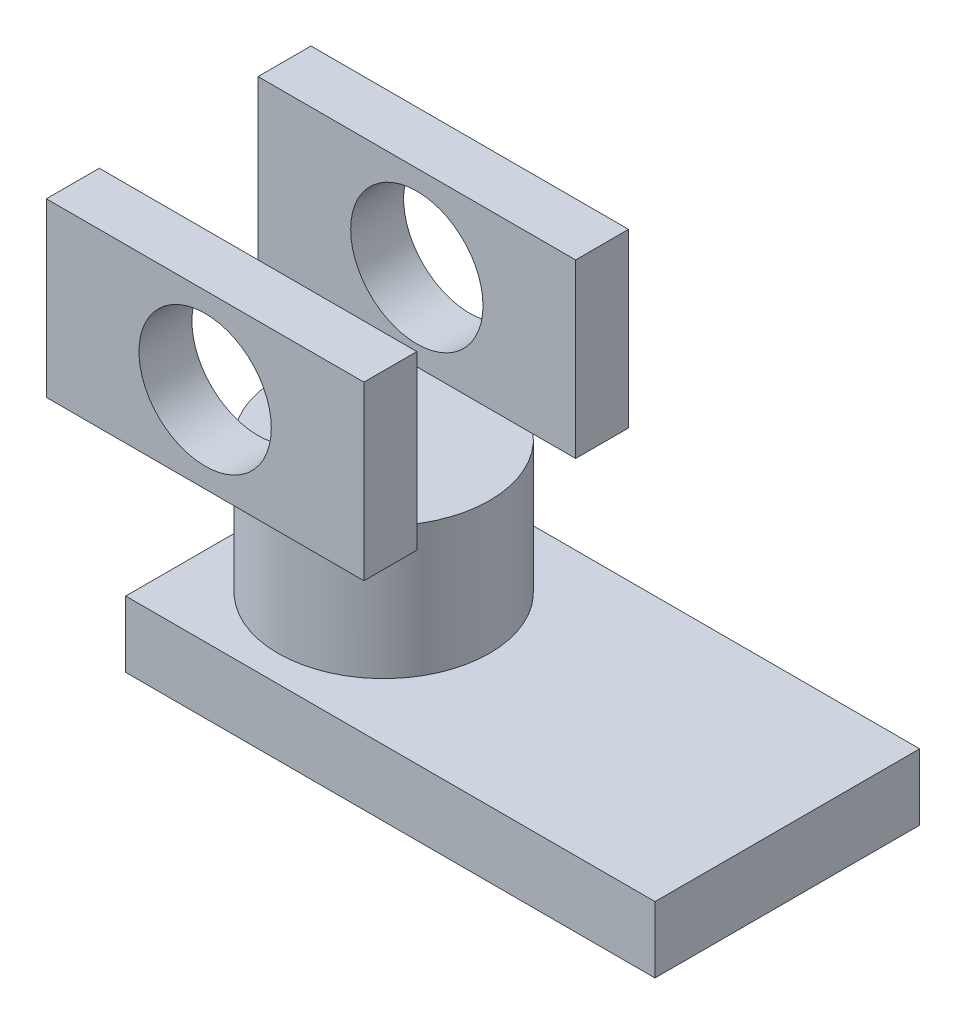
ISO-10303-21;
HEADER;
FILE_DESCRIPTION(('STEP AP214'),'2;1');
FILE_NAME('part.step','',(''),(''),'','','');
FILE_SCHEMA(('AUTOMOTIVE_DESIGN { 1 0 10303 214 1 1 1 1 }'));
ENDSEC;
DATA;
#1=APPLICATION_CONTEXT('core data for automotive mechanical design processes');
#2=APPLICATION_PROTOCOL_DEFINITION('international standard','automotive_design',2000,#1);
#3=PRODUCT_CONTEXT('',#1,'mechanical');
#4=PRODUCT('Part','Part','',(#3));
#5=PRODUCT_RELATED_PRODUCT_CATEGORY('part','',(#4));
#6=PRODUCT_DEFINITION_FORMATION('','',#4);
#7=PRODUCT_DEFINITION_CONTEXT('part definition',#1,'design');
#8=PRODUCT_DEFINITION('design','',#6,#7);
#9=PRODUCT_DEFINITION_SHAPE('','',#8);
#10=(LENGTH_UNIT() NAMED_UNIT(*) SI_UNIT(.MILLI.,.METRE.));
#11=(NAMED_UNIT(*) PLANE_ANGLE_UNIT() SI_UNIT($,.RADIAN.));
#12=(NAMED_UNIT(*) SI_UNIT($,.STERADIAN.) SOLID_ANGLE_UNIT());
#13=UNCERTAINTY_MEASURE_WITH_UNIT(LENGTH_MEASURE(1.E-05),#10,'distance_accuracy_value','');
#14=(GEOMETRIC_REPRESENTATION_CONTEXT(3) GLOBAL_UNCERTAINTY_ASSIGNED_CONTEXT((#13)) GLOBAL_UNIT_ASSIGNED_CONTEXT((#10,
#11,#12)) REPRESENTATION_CONTEXT('',''));
#15=CARTESIAN_POINT('',(0.,0.,0.));
#16=DIRECTION('',(0.,0.,1.));
#17=DIRECTION('',(1.,0.,0.));
#18=AXIS2_PLACEMENT_3D('',#15,#16,#17);
#19=CARTESIAN_POINT('',(-6.,0.,-20.));
#20=DIRECTION('',(-1.,0.,0.));
#21=DIRECTION('',(0.,0.,1.));
#22=AXIS2_PLACEMENT_3D('',#19,#20,#21);
#23=PLANE('',#22);
#24=DIRECTION('',(0.,-1.,0.));
#25=VECTOR('',#24,1.);
#26=CARTESIAN_POINT('',(-6.,28.,-4.));
#27=LINE('',#26,#25);
#28=CARTESIAN_POINT('',(-6.,28.,-4.));
#29=VERTEX_POINT('',#28);
#30=CARTESIAN_POINT('',(-6.,15.,-4.));
#31=VERTEX_POINT('',#30);
#32=EDGE_CURVE('E158',#29,#31,#27,.T.);
#33=ORIENTED_EDGE('',*,*,#32,.T.);
#34=DIRECTION('',(0.,0.,1.));
#35=VECTOR('',#34,1.);
#36=CARTESIAN_POINT('',(-6.,15.,-20.));
#37=LINE('',#36,#35);
#38=CARTESIAN_POINT('',(-6.,15.,0.));
#39=VERTEX_POINT('',#38);
#40=EDGE_CURVE('E171',#31,#39,#37,.T.);
#41=ORIENTED_EDGE('',*,*,#40,.T.);
#42=DIRECTION('',(0.,-1.,0.));
#43=VECTOR('',#42,1.);
#44=CARTESIAN_POINT('',(-6.,0.,0.));
#45=LINE('',#44,#43);
#46=CARTESIAN_POINT('',(-6.,28.,0.));
#47=VERTEX_POINT('',#46);
#48=EDGE_CURVE('E285',#47,#39,#45,.T.);
#49=ORIENTED_EDGE('',*,*,#48,.F.);
#50=DIRECTION('',(0.,0.,1.));
#51=VECTOR('',#50,1.);
#52=CARTESIAN_POINT('',(-6.,28.,-20.));
#53=LINE('',#52,#51);
#54=EDGE_CURVE('E173',#29,#47,#53,.T.);
#55=ORIENTED_EDGE('',*,*,#54,.F.);
#56=EDGE_LOOP('',(#33,#41,#49,#55));
#57=FACE_BOUND('',#56,.T.);
#58=ADVANCED_FACE('F43',(#57),#23,.T.);
#59=CARTESIAN_POINT('',(0.,28.,-20.));
#60=DIRECTION('',(0.,1.,0.));
#61=DIRECTION('',(-1.,0.,0.));
#62=AXIS2_PLACEMENT_3D('',#59,#60,#61);
#63=PLANE('',#62);
#64=DIRECTION('',(1.,0.,0.));
#65=VECTOR('',#64,1.);
#66=CARTESIAN_POINT('',(-6.,28.,-4.));
#67=LINE('',#66,#65);
#68=CARTESIAN_POINT('',(18.,28.,-4.));
#69=VERTEX_POINT('',#68);
#70=EDGE_CURVE('E289',#29,#69,#67,.T.);
#71=ORIENTED_EDGE('',*,*,#70,.F.);
#72=ORIENTED_EDGE('',*,*,#54,.T.);
#73=DIRECTION('',(-1.,0.,0.));
#74=VECTOR('',#73,1.);
#75=CARTESIAN_POINT('',(0.,28.,0.));
#76=LINE('',#75,#74);
#77=CARTESIAN_POINT('',(18.,28.,0.));
#78=VERTEX_POINT('',#77);
#79=EDGE_CURVE('E282',#78,#47,#76,.T.);
#80=ORIENTED_EDGE('',*,*,#79,.F.);
#81=DIRECTION('',(0.,0.,1.));
#82=VECTOR('',#81,1.);
#83=CARTESIAN_POINT('',(18.,28.,-20.));
#84=LINE('',#83,#82);
#85=EDGE_CURVE('E267',#69,#78,#84,.T.);
#86=ORIENTED_EDGE('',*,*,#85,.F.);
#87=EDGE_LOOP('',(#71,#72,#80,#86));
#88=FACE_BOUND('',#87,.T.);
#89=ADVANCED_FACE('F300',(#88),#63,.T.);
#90=CARTESIAN_POINT('',(18.,0.,-20.));
#91=DIRECTION('',(1.,0.,0.));
#92=DIRECTION('',(0.,0.,-1.));
#93=AXIS2_PLACEMENT_3D('',#90,#91,#92);
#94=PLANE('',#93);
#95=DIRECTION('',(0.,-1.,0.));
#96=VECTOR('',#95,1.);
#97=CARTESIAN_POINT('',(18.,28.,-4.));
#98=LINE('',#97,#96);
#99=CARTESIAN_POINT('',(18.,15.,-4.));
#100=VERTEX_POINT('',#99);
#101=EDGE_CURVE('E259',#69,#100,#98,.T.);
#102=ORIENTED_EDGE('',*,*,#101,.F.);
#103=ORIENTED_EDGE('',*,*,#85,.T.);
#104=DIRECTION('',(0.,1.,0.));
#105=VECTOR('',#104,1.);
#106=CARTESIAN_POINT('',(18.,0.,0.));
#107=LINE('',#106,#105);
#108=CARTESIAN_POINT('',(18.,15.,0.));
#109=VERTEX_POINT('',#108);
#110=EDGE_CURVE('E275',#109,#78,#107,.T.);
#111=ORIENTED_EDGE('',*,*,#110,.F.);
#112=DIRECTION('',(0.,0.,1.));
#113=VECTOR('',#112,1.);
#114=CARTESIAN_POINT('',(18.,15.,-20.));
#115=LINE('',#114,#113);
#116=EDGE_CURVE('E190',#100,#109,#115,.T.);
#117=ORIENTED_EDGE('',*,*,#116,.F.);
#118=EDGE_LOOP('',(#102,#103,#111,#117));
#119=FACE_BOUND('',#118,.T.);
#120=ADVANCED_FACE('F276',(#119),#94,.T.);
#121=CARTESIAN_POINT('',(0.,15.,-20.));
#122=DIRECTION('',(0.,-1.,0.));
#123=DIRECTION('',(0.,0.,-1.));
#124=AXIS2_PLACEMENT_3D('',#121,#122,#123);
#125=PLANE('',#124);
#126=DIRECTION('',(-1.,0.,0.));
#127=VECTOR('',#126,1.);
#128=CARTESIAN_POINT('',(0.,15.,-4.));
#129=LINE('',#128,#127);
#130=CARTESIAN_POINT('',(14.7915026221292,15.,-4.));
#131=VERTEX_POINT('',#130);
#132=EDGE_CURVE('E11',#100,#131,#129,.T.);
#133=ORIENTED_EDGE('',*,*,#132,.F.);
#134=ORIENTED_EDGE('',*,*,#116,.T.);
#135=DIRECTION('',(1.,0.,0.));
#136=VECTOR('',#135,1.);
#137=CARTESIAN_POINT('',(0.,15.,0.));
#138=LINE('',#137,#136);
#139=EDGE_CURVE('E181',#39,#109,#138,.T.);
#140=ORIENTED_EDGE('',*,*,#139,.F.);
#141=ORIENTED_EDGE('',*,*,#40,.F.);
#142=DIRECTION('',(1.,0.,0.));
#143=VECTOR('',#142,1.);
#144=CARTESIAN_POINT('',(-6.,15.,-4.));
#145=LINE('',#144,#143);
#146=CARTESIAN_POINT('',(4.20849737787082,15.,-4.));
#147=VERTEX_POINT('',#146);
#148=EDGE_CURVE('E155',#31,#147,#145,.T.);
#149=ORIENTED_EDGE('',*,*,#148,.T.);
#150=CARTESIAN_POINT('',(9.5,15.,-10.));
#151=DIRECTION('',(0.,1.,0.));
#152=DIRECTION('',(0.,0.,1.));
#153=AXIS2_PLACEMENT_3D('',#150,#151,#152);
#154=CIRCLE('',#153,8.);
#155=EDGE_CURVE('E203',#147,#131,#154,.T.);
#156=ORIENTED_EDGE('',*,*,#155,.T.);
#157=EDGE_LOOP('',(#133,#134,#140,#141,#149,#156));
#158=FACE_BOUND('',#157,.T.);
#159=ADVANCED_FACE('F179',(#158),#125,.T.);
#160=CARTESIAN_POINT('',(0.,5.,0.));
#161=DIRECTION('',(0.,0.,-1.));
#162=DIRECTION('',(-1.,0.,0.));
#163=AXIS2_PLACEMENT_3D('',#160,#161,#162);
#164=PLANE('',#163);
#165=DIRECTION('',(1.,0.,0.));
#166=VECTOR('',#165,1.);
#167=CARTESIAN_POINT('',(0.,0.,0.));
#168=LINE('',#167,#166);
#169=CARTESIAN_POINT('',(0.,0.,0.));
#170=VERTEX_POINT('',#169);
#171=CARTESIAN_POINT('',(40.,0.,0.));
#172=VERTEX_POINT('',#171);
#173=EDGE_CURVE('E201',#170,#172,#168,.T.);
#174=ORIENTED_EDGE('',*,*,#173,.T.);
#175=DIRECTION('',(0.,-1.,0.));
#176=VECTOR('',#175,1.);
#177=CARTESIAN_POINT('',(40.,5.,0.));
#178=LINE('',#177,#176);
#179=CARTESIAN_POINT('',(40.,5.,0.));
#180=VERTEX_POINT('',#179);
#181=EDGE_CURVE('E240',#180,#172,#178,.T.);
#182=ORIENTED_EDGE('',*,*,#181,.F.);
#183=DIRECTION('',(1.,0.,0.));
#184=VECTOR('',#183,1.);
#185=CARTESIAN_POINT('',(0.,5.,0.));
#186=LINE('',#185,#184);
#187=CARTESIAN_POINT('',(0.,5.,0.));
#188=VERTEX_POINT('',#187);
#189=EDGE_CURVE('E209',#188,#180,#186,.T.);
#190=ORIENTED_EDGE('',*,*,#189,.F.);
#191=DIRECTION('',(0.,-1.,0.));
#192=VECTOR('',#191,1.);
#193=CARTESIAN_POINT('',(0.,5.,0.));
#194=LINE('',#193,#192);
#195=EDGE_CURVE('E219',#188,#170,#194,.T.);
#196=ORIENTED_EDGE('',*,*,#195,.T.);
#197=EDGE_LOOP('',(#174,#182,#190,#196));
#198=FACE_BOUND('',#197,.T.);
#199=ADVANCED_FACE('F45',(#198),#164,.F.);
#200=CARTESIAN_POINT('',(40.,5.,0.));
#201=DIRECTION('',(-1.,0.,0.));
#202=DIRECTION('',(0.,0.,1.));
#203=AXIS2_PLACEMENT_3D('',#200,#201,#202);
#204=PLANE('',#203);
#205=DIRECTION('',(0.,0.,-1.));
#206=VECTOR('',#205,1.);
#207=CARTESIAN_POINT('',(40.,0.,0.));
#208=LINE('',#207,#206);
#209=CARTESIAN_POINT('',(40.,0.,-20.));
#210=VERTEX_POINT('',#209);
#211=EDGE_CURVE('E223',#172,#210,#208,.T.);
#212=ORIENTED_EDGE('',*,*,#211,.T.);
#213=DIRECTION('',(0.,-1.,0.));
#214=VECTOR('',#213,1.);
#215=CARTESIAN_POINT('',(40.,5.,-20.));
#216=LINE('',#215,#214);
#217=CARTESIAN_POINT('',(40.,5.,-20.));
#218=VERTEX_POINT('',#217);
#219=EDGE_CURVE('E236',#218,#210,#216,.T.);
#220=ORIENTED_EDGE('',*,*,#219,.F.);
#221=DIRECTION('',(0.,0.,-1.));
#222=VECTOR('',#221,1.);
#223=CARTESIAN_POINT('',(40.,5.,0.));
#224=LINE('',#223,#222);
#225=EDGE_CURVE('E98',#180,#218,#224,.T.);
#226=ORIENTED_EDGE('',*,*,#225,.F.);
#227=ORIENTED_EDGE('',*,*,#181,.T.);
#228=EDGE_LOOP('',(#212,#220,#226,#227));
#229=FACE_BOUND('',#228,.T.);
#230=ADVANCED_FACE('F397',(#229),#204,.F.);
#231=CARTESIAN_POINT('',(0.,5.,-20.));
#232=DIRECTION('',(0.,0.,1.));
#233=DIRECTION('',(1.,0.,0.));
#234=AXIS2_PLACEMENT_3D('',#231,#232,#233);
#235=PLANE('',#234);
#236=DIRECTION('',(-1.,0.,0.));
#237=VECTOR('',#236,1.);
#238=CARTESIAN_POINT('',(0.,0.,-20.));
#239=LINE('',#238,#237);
#240=CARTESIAN_POINT('',(0.,0.,-20.));
#241=VERTEX_POINT('',#240);
#242=EDGE_CURVE('E226',#210,#241,#239,.T.);
#243=ORIENTED_EDGE('',*,*,#242,.T.);
#244=DIRECTION('',(0.,-1.,0.));
#245=VECTOR('',#244,1.);
#246=CARTESIAN_POINT('',(0.,5.,-20.));
#247=LINE('',#246,#245);
#248=CARTESIAN_POINT('',(0.,5.,-20.));
#249=VERTEX_POINT('',#248);
#250=EDGE_CURVE('E233',#249,#241,#247,.T.);
#251=ORIENTED_EDGE('',*,*,#250,.F.);
#252=DIRECTION('',(-1.,0.,0.));
#253=VECTOR('',#252,1.);
#254=CARTESIAN_POINT('',(0.,5.,-20.));
#255=LINE('',#254,#253);
#256=EDGE_CURVE('E214',#218,#249,#255,.T.);
#257=ORIENTED_EDGE('',*,*,#256,.F.);
#258=ORIENTED_EDGE('',*,*,#219,.T.);
#259=EDGE_LOOP('',(#243,#251,#257,#258));
#260=FACE_BOUND('',#259,.T.);
#261=ADVANCED_FACE('F395',(#260),#235,.F.);
#262=CARTESIAN_POINT('',(0.,5.,0.));
#263=DIRECTION('',(1.,0.,0.));
#264=DIRECTION('',(0.,0.,-1.));
#265=AXIS2_PLACEMENT_3D('',#262,#263,#264);
#266=PLANE('',#265);
#267=DIRECTION('',(0.,0.,1.));
#268=VECTOR('',#267,1.);
#269=CARTESIAN_POINT('',(0.,0.,0.));
#270=LINE('',#269,#268);
#271=EDGE_CURVE('E90',#241,#170,#270,.T.);
#272=ORIENTED_EDGE('',*,*,#271,.T.);
#273=ORIENTED_EDGE('',*,*,#195,.F.);
#274=DIRECTION('',(0.,0.,1.));
#275=VECTOR('',#274,1.);
#276=CARTESIAN_POINT('',(0.,5.,0.));
#277=LINE('',#276,#275);
#278=EDGE_CURVE('E69',#249,#188,#277,.T.);
#279=ORIENTED_EDGE('',*,*,#278,.F.);
#280=ORIENTED_EDGE('',*,*,#250,.T.);
#281=EDGE_LOOP('',(#272,#273,#279,#280));
#282=FACE_BOUND('',#281,.T.);
#283=ADVANCED_FACE('F390',(#282),#266,.F.);
#284=CARTESIAN_POINT('',(0.,5.,0.));
#285=DIRECTION('',(0.,1.,0.));
#286=DIRECTION('',(0.,0.,1.));
#287=AXIS2_PLACEMENT_3D('',#284,#285,#286);
#288=PLANE('',#287);
#289=CARTESIAN_POINT('',(9.5,5.,-10.));
#290=DIRECTION('',(0.,1.,0.));
#291=DIRECTION('',(0.,0.,1.));
#292=AXIS2_PLACEMENT_3D('',#289,#290,#291);
#293=CIRCLE('',#292,8.);
#294=CARTESIAN_POINT('',(9.5,5.,-2.));
#295=VERTEX_POINT('',#294);
#296=EDGE_CURVE('E204',#295,#295,#293,.T.);
#297=ORIENTED_EDGE('',*,*,#296,.F.);
#298=EDGE_LOOP('',(#297));
#299=FACE_BOUND('',#298,.T.);
#300=ORIENTED_EDGE('',*,*,#189,.T.);
#301=ORIENTED_EDGE('',*,*,#225,.T.);
#302=ORIENTED_EDGE('',*,*,#256,.T.);
#303=ORIENTED_EDGE('',*,*,#278,.T.);
#304=EDGE_LOOP('',(#300,#301,#302,#303));
#305=FACE_BOUND('',#304,.T.);
#306=ADVANCED_FACE('F383',(#299,#305),#288,.T.);
#307=CARTESIAN_POINT('',(0.,0.,0.));
#308=DIRECTION('',(0.,1.,0.));
#309=DIRECTION('',(0.,0.,1.));
#310=AXIS2_PLACEMENT_3D('',#307,#308,#309);
#311=PLANE('',#310);
#312=ORIENTED_EDGE('',*,*,#173,.F.);
#313=ORIENTED_EDGE('',*,*,#271,.F.);
#314=ORIENTED_EDGE('',*,*,#242,.F.);
#315=ORIENTED_EDGE('',*,*,#211,.F.);
#316=EDGE_LOOP('',(#312,#313,#314,#315));
#317=FACE_BOUND('',#316,.T.);
#318=ADVANCED_FACE('F378',(#317),#311,.F.);
#319=CARTESIAN_POINT('',(9.5,15.,-10.));
#320=DIRECTION('',(0.,-1.,0.));
#321=DIRECTION('',(0.,0.,-1.));
#322=AXIS2_PLACEMENT_3D('',#319,#320,#321);
#323=CYLINDRICAL_SURFACE('',#322,8.);
#324=CARTESIAN_POINT('',(14.7915026221292,15.,-16.));
#325=VERTEX_POINT('',#324);
#326=EDGE_CURVE('E198',#131,#325,#154,.T.);
#327=ORIENTED_EDGE('',*,*,#326,.F.);
#328=ORIENTED_EDGE('',*,*,#155,.F.);
#329=CARTESIAN_POINT('',(4.20849737787082,15.,-16.));
#330=VERTEX_POINT('',#329);
#331=EDGE_CURVE('E433',#330,#147,#154,.T.);
#332=ORIENTED_EDGE('',*,*,#331,.F.);
#333=EDGE_CURVE('E202',#325,#330,#154,.T.);
#334=ORIENTED_EDGE('',*,*,#333,.F.);
#335=EDGE_LOOP('',(#327,#328,#332,#334));
#336=FACE_BOUND('',#335,.T.);
#337=ORIENTED_EDGE('',*,*,#296,.T.);
#338=EDGE_LOOP('',(#337));
#339=FACE_BOUND('',#338,.T.);
#340=ADVANCED_FACE('F373',(#336,#339),#323,.T.);
#341=DIRECTION('',(0.,1.,0.));
#342=VECTOR('',#341,1.);
#343=CARTESIAN_POINT('',(-6.,15.,-16.));
#344=LINE('',#343,#342);
#345=CARTESIAN_POINT('',(-6.,15.,-16.));
#346=VERTEX_POINT('',#345);
#347=CARTESIAN_POINT('',(-6.,28.,-16.));
#348=VERTEX_POINT('',#347);
#349=EDGE_CURVE('E175',#346,#348,#344,.T.);
#350=ORIENTED_EDGE('',*,*,#349,.T.);
#351=CARTESIAN_POINT('',(-6.,28.,-20.));
#352=VERTEX_POINT('',#351);
#353=EDGE_CURVE('E208',#352,#348,#53,.T.);
#354=ORIENTED_EDGE('',*,*,#353,.F.);
#355=DIRECTION('',(0.,-1.,0.));
#356=VECTOR('',#355,1.);
#357=CARTESIAN_POINT('',(-6.,0.,-20.));
#358=LINE('',#357,#356);
#359=CARTESIAN_POINT('',(-6.,15.,-20.));
#360=VERTEX_POINT('',#359);
#361=EDGE_CURVE('E294',#352,#360,#358,.T.);
#362=ORIENTED_EDGE('',*,*,#361,.T.);
#363=EDGE_CURVE('E184',#360,#346,#37,.T.);
#364=ORIENTED_EDGE('',*,*,#363,.T.);
#365=EDGE_LOOP('',(#350,#354,#362,#364));
#366=FACE_BOUND('',#365,.T.);
#367=ADVANCED_FACE('F325',(#366),#23,.T.);
#368=DIRECTION('',(1.,0.,0.));
#369=VECTOR('',#368,1.);
#370=CARTESIAN_POINT('',(-6.,28.,-16.));
#371=LINE('',#370,#369);
#372=CARTESIAN_POINT('',(18.,28.,-16.));
#373=VERTEX_POINT('',#372);
#374=EDGE_CURVE('E302',#348,#373,#371,.T.);
#375=ORIENTED_EDGE('',*,*,#374,.T.);
#376=CARTESIAN_POINT('',(18.,28.,-20.));
#377=VERTEX_POINT('',#376);
#378=EDGE_CURVE('E257',#377,#373,#84,.T.);
#379=ORIENTED_EDGE('',*,*,#378,.F.);
#380=DIRECTION('',(-1.,0.,0.));
#381=VECTOR('',#380,1.);
#382=CARTESIAN_POINT('',(0.,28.,-20.));
#383=LINE('',#382,#381);
#384=EDGE_CURVE('E185',#377,#352,#383,.T.);
#385=ORIENTED_EDGE('',*,*,#384,.T.);
#386=ORIENTED_EDGE('',*,*,#353,.T.);
#387=EDGE_LOOP('',(#375,#379,#385,#386));
#388=FACE_BOUND('',#387,.T.);
#389=ADVANCED_FACE('F322',(#388),#63,.T.);
#390=DIRECTION('',(0.,1.,0.));
#391=VECTOR('',#390,1.);
#392=CARTESIAN_POINT('',(18.,15.,-16.));
#393=LINE('',#392,#391);
#394=CARTESIAN_POINT('',(18.,15.,-16.));
#395=VERTEX_POINT('',#394);
#396=EDGE_CURVE('E176',#395,#373,#393,.T.);
#397=ORIENTED_EDGE('',*,*,#396,.F.);
#398=CARTESIAN_POINT('',(18.,15.,-20.));
#399=VERTEX_POINT('',#398);
#400=EDGE_CURVE('E196',#399,#395,#115,.T.);
#401=ORIENTED_EDGE('',*,*,#400,.F.);
#402=DIRECTION('',(0.,1.,0.));
#403=VECTOR('',#402,1.);
#404=CARTESIAN_POINT('',(18.,0.,-20.));
#405=LINE('',#404,#403);
#406=EDGE_CURVE('E192',#399,#377,#405,.T.);
#407=ORIENTED_EDGE('',*,*,#406,.T.);
#408=ORIENTED_EDGE('',*,*,#378,.T.);
#409=EDGE_LOOP('',(#397,#401,#407,#408));
#410=FACE_BOUND('',#409,.T.);
#411=ADVANCED_FACE('F254',(#410),#94,.T.);
#412=DIRECTION('',(1.,0.,0.));
#413=VECTOR('',#412,1.);
#414=CARTESIAN_POINT('',(-6.,15.,-16.));
#415=LINE('',#414,#413);
#416=EDGE_CURVE('E305',#346,#330,#415,.T.);
#417=ORIENTED_EDGE('',*,*,#416,.F.);
#418=ORIENTED_EDGE('',*,*,#363,.F.);
#419=DIRECTION('',(1.,0.,0.));
#420=VECTOR('',#419,1.);
#421=CARTESIAN_POINT('',(0.,15.,-20.));
#422=LINE('',#421,#420);
#423=EDGE_CURVE('E265',#360,#399,#422,.T.);
#424=ORIENTED_EDGE('',*,*,#423,.T.);
#425=ORIENTED_EDGE('',*,*,#400,.T.);
#426=DIRECTION('',(1.,0.,0.));
#427=VECTOR('',#426,1.);
#428=CARTESIAN_POINT('',(0.,15.,-16.));
#429=LINE('',#428,#427);
#430=EDGE_CURVE('E53',#325,#395,#429,.T.);
#431=ORIENTED_EDGE('',*,*,#430,.F.);
#432=ORIENTED_EDGE('',*,*,#333,.T.);
#433=EDGE_LOOP('',(#417,#418,#424,#425,#431,#432));
#434=FACE_BOUND('',#433,.T.);
#435=ADVANCED_FACE('F263',(#434),#125,.T.);
#436=CARTESIAN_POINT('',(0.,0.,-20.));
#437=DIRECTION('',(0.,0.,1.));
#438=DIRECTION('',(1.,0.,0.));
#439=AXIS2_PLACEMENT_3D('',#436,#437,#438);
#440=PLANE('',#439);
#441=CARTESIAN_POINT('',(6.,21.5,-20.));
#442=DIRECTION('',(0.,0.,1.));
#443=DIRECTION('',(1.,0.,0.));
#444=AXIS2_PLACEMENT_3D('',#441,#442,#443);
#445=CIRCLE('',#444,5.);
#446=CARTESIAN_POINT('',(11.,21.5,-20.));
#447=VERTEX_POINT('',#446);
#448=EDGE_CURVE('E338',#447,#447,#445,.T.);
#449=ORIENTED_EDGE('',*,*,#448,.T.);
#450=EDGE_LOOP('',(#449));
#451=FACE_BOUND('',#450,.T.);
#452=ORIENTED_EDGE('',*,*,#361,.F.);
#453=ORIENTED_EDGE('',*,*,#384,.F.);
#454=ORIENTED_EDGE('',*,*,#406,.F.);
#455=ORIENTED_EDGE('',*,*,#423,.F.);
#456=EDGE_LOOP('',(#452,#453,#454,#455));
#457=FACE_BOUND('',#456,.T.);
#458=ADVANCED_FACE('F320',(#451,#457),#440,.F.);
#459=CARTESIAN_POINT('',(0.,0.,0.));
#460=DIRECTION('',(0.,0.,1.));
#461=DIRECTION('',(1.,0.,0.));
#462=AXIS2_PLACEMENT_3D('',#459,#460,#461);
#463=PLANE('',#462);
#464=CARTESIAN_POINT('',(6.,21.5,0.));
#465=DIRECTION('',(0.,0.,1.));
#466=DIRECTION('',(1.,0.,0.));
#467=AXIS2_PLACEMENT_3D('',#464,#465,#466);
#468=CIRCLE('',#467,5.);
#469=CARTESIAN_POINT('',(11.,21.5,0.));
#470=VERTEX_POINT('',#469);
#471=EDGE_CURVE('E340',#470,#470,#468,.T.);
#472=ORIENTED_EDGE('',*,*,#471,.F.);
#473=EDGE_LOOP('',(#472));
#474=FACE_BOUND('',#473,.T.);
#475=ORIENTED_EDGE('',*,*,#48,.T.);
#476=ORIENTED_EDGE('',*,*,#139,.T.);
#477=ORIENTED_EDGE('',*,*,#110,.T.);
#478=ORIENTED_EDGE('',*,*,#79,.T.);
#479=EDGE_LOOP('',(#475,#476,#477,#478));
#480=FACE_BOUND('',#479,.T.);
#481=ADVANCED_FACE('F284',(#474,#480),#463,.T.);
#482=CARTESIAN_POINT('',(-6.,15.,-10.));
#483=DIRECTION('',(0.,-1.,0.));
#484=DIRECTION('',(0.,0.,-1.));
#485=AXIS2_PLACEMENT_3D('',#482,#483,#484);
#486=PLANE('',#485);
#487=EDGE_CURVE('E60',#330,#325,#415,.T.);
#488=ORIENTED_EDGE('',*,*,#487,.F.);
#489=ORIENTED_EDGE('',*,*,#331,.T.);
#490=EDGE_CURVE('E161',#147,#131,#145,.T.);
#491=ORIENTED_EDGE('',*,*,#490,.T.);
#492=ORIENTED_EDGE('',*,*,#326,.T.);
#493=EDGE_LOOP('',(#488,#489,#491,#492));
#494=FACE_BOUND('',#493,.T.);
#495=ADVANCED_FACE('F361',(#494),#486,.F.);
#496=CARTESIAN_POINT('',(-6.,28.,-4.));
#497=DIRECTION('',(0.,0.,1.));
#498=DIRECTION('',(1.,0.,0.));
#499=AXIS2_PLACEMENT_3D('',#496,#497,#498);
#500=PLANE('',#499);
#501=CARTESIAN_POINT('',(6.,21.5,-4.));
#502=DIRECTION('',(0.,0.,1.));
#503=DIRECTION('',(1.,0.,0.));
#504=AXIS2_PLACEMENT_3D('',#501,#502,#503);
#505=CIRCLE('',#504,5.);
#506=CARTESIAN_POINT('',(11.,21.5,-4.));
#507=VERTEX_POINT('',#506);
#508=EDGE_CURVE('E331',#507,#507,#505,.T.);
#509=ORIENTED_EDGE('',*,*,#508,.T.);
#510=EDGE_LOOP('',(#509));
#511=FACE_BOUND('',#510,.T.);
#512=ORIENTED_EDGE('',*,*,#101,.T.);
#513=ORIENTED_EDGE('',*,*,#132,.T.);
#514=ORIENTED_EDGE('',*,*,#490,.F.);
#515=ORIENTED_EDGE('',*,*,#148,.F.);
#516=ORIENTED_EDGE('',*,*,#32,.F.);
#517=ORIENTED_EDGE('',*,*,#70,.T.);
#518=EDGE_LOOP('',(#512,#513,#514,#515,#516,#517));
#519=FACE_BOUND('',#518,.T.);
#520=ADVANCED_FACE('F157',(#511,#519),#500,.F.);
#521=CARTESIAN_POINT('',(-6.,15.,-16.));
#522=DIRECTION('',(0.,0.,-1.));
#523=DIRECTION('',(-1.,0.,0.));
#524=AXIS2_PLACEMENT_3D('',#521,#522,#523);
#525=PLANE('',#524);
#526=CARTESIAN_POINT('',(6.,21.5,-16.));
#527=DIRECTION('',(0.,0.,-1.));
#528=DIRECTION('',(-1.,0.,0.));
#529=AXIS2_PLACEMENT_3D('',#526,#527,#528);
#530=CIRCLE('',#529,5.);
#531=CARTESIAN_POINT('',(1.,21.5,-16.));
#532=VERTEX_POINT('',#531);
#533=EDGE_CURVE('E47',#532,#532,#530,.T.);
#534=ORIENTED_EDGE('',*,*,#533,.T.);
#535=EDGE_LOOP('',(#534));
#536=FACE_BOUND('',#535,.T.);
#537=ORIENTED_EDGE('',*,*,#396,.T.);
#538=ORIENTED_EDGE('',*,*,#374,.F.);
#539=ORIENTED_EDGE('',*,*,#349,.F.);
#540=ORIENTED_EDGE('',*,*,#416,.T.);
#541=ORIENTED_EDGE('',*,*,#487,.T.);
#542=ORIENTED_EDGE('',*,*,#430,.T.);
#543=EDGE_LOOP('',(#537,#538,#539,#540,#541,#542));
#544=FACE_BOUND('',#543,.T.);
#545=ADVANCED_FACE('F246',(#536,#544),#525,.F.);
#546=CARTESIAN_POINT('',(6.,21.5,-20.));
#547=DIRECTION('',(0.,0.,1.));
#548=DIRECTION('',(1.,0.,0.));
#549=AXIS2_PLACEMENT_3D('',#546,#547,#548);
#550=CYLINDRICAL_SURFACE('',#549,5.);
#551=ORIENTED_EDGE('',*,*,#448,.F.);
#552=EDGE_LOOP('',(#551));
#553=FACE_BOUND('',#552,.T.);
#554=ORIENTED_EDGE('',*,*,#533,.F.);
#555=EDGE_LOOP('',(#554));
#556=FACE_BOUND('',#555,.T.);
#557=ADVANCED_FACE('F349',(#553,#556),#550,.F.);
#558=ORIENTED_EDGE('',*,*,#471,.T.);
#559=EDGE_LOOP('',(#558));
#560=FACE_BOUND('',#559,.T.);
#561=ORIENTED_EDGE('',*,*,#508,.F.);
#562=EDGE_LOOP('',(#561));
#563=FACE_BOUND('',#562,.T.);
#564=ADVANCED_FACE('F352',(#560,#563),#550,.F.);
#565=CLOSED_SHELL('',(#58,#89,#120,#159,#199,#230,#261,#283,#306,#318,#340,#367,#389,#411,#435,
#458,#481,#495,#520,#545,#557,#564));
#566=MANIFOLD_SOLID_BREP('B2',#565);
#567=ADVANCED_BREP_SHAPE_REPRESENTATION('',(#18,#566),#14);
#568=SHAPE_DEFINITION_REPRESENTATION(#9,#567);
ENDSEC;
END-ISO-10303-21;
